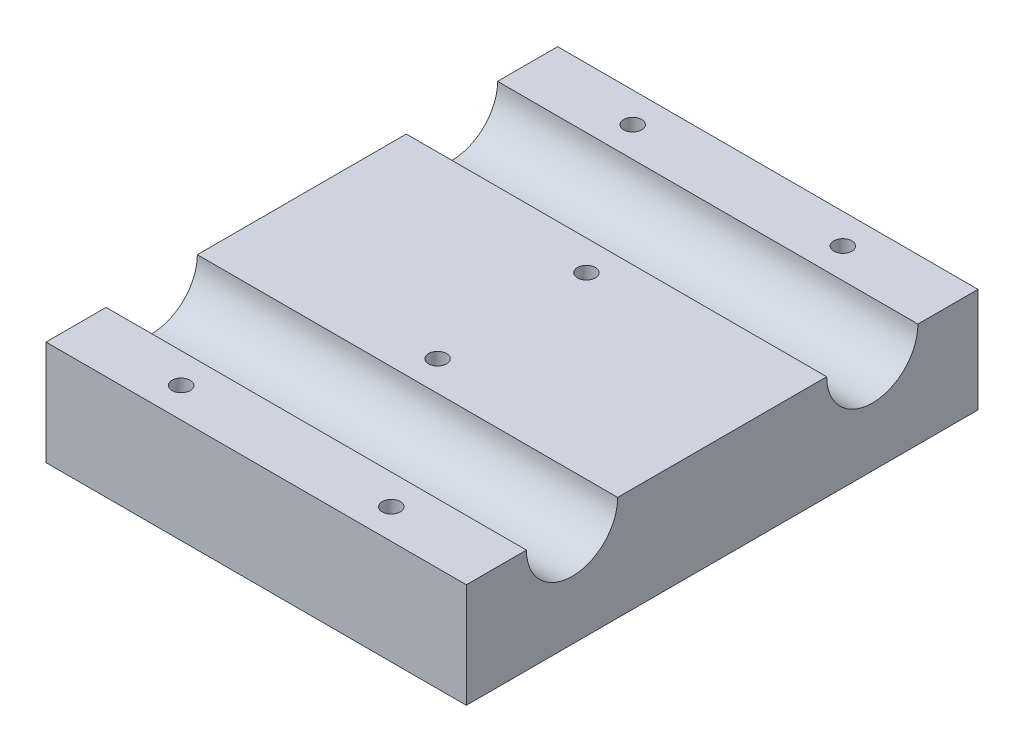
ISO-10303-21;
HEADER;
FILE_DESCRIPTION(('STEP AP214'),'2;1');
FILE_NAME('part.step','',(''),(''),'','','');
FILE_SCHEMA(('AUTOMOTIVE_DESIGN { 1 0 10303 214 1 1 1 1 }'));
ENDSEC;
DATA;
#1=APPLICATION_CONTEXT('core data for automotive mechanical design processes');
#2=APPLICATION_PROTOCOL_DEFINITION('international standard','automotive_design',2000,#1);
#3=PRODUCT_CONTEXT('',#1,'mechanical');
#4=PRODUCT('Part','Part','',(#3));
#5=PRODUCT_RELATED_PRODUCT_CATEGORY('part','',(#4));
#6=PRODUCT_DEFINITION_FORMATION('','',#4);
#7=PRODUCT_DEFINITION_CONTEXT('part definition',#1,'design');
#8=PRODUCT_DEFINITION('design','',#6,#7);
#9=PRODUCT_DEFINITION_SHAPE('','',#8);
#10=(LENGTH_UNIT() NAMED_UNIT(*) SI_UNIT(.MILLI.,.METRE.));
#11=(NAMED_UNIT(*) PLANE_ANGLE_UNIT() SI_UNIT($,.RADIAN.));
#12=(NAMED_UNIT(*) SI_UNIT($,.STERADIAN.) SOLID_ANGLE_UNIT());
#13=UNCERTAINTY_MEASURE_WITH_UNIT(LENGTH_MEASURE(1.E-05),#10,'distance_accuracy_value','');
#14=(GEOMETRIC_REPRESENTATION_CONTEXT(3) GLOBAL_UNCERTAINTY_ASSIGNED_CONTEXT((#13)) GLOBAL_UNIT_ASSIGNED_CONTEXT((#10,
#11,#12)) REPRESENTATION_CONTEXT('',''));
#15=CARTESIAN_POINT('',(0.,0.,0.));
#16=DIRECTION('',(0.,0.,1.));
#17=DIRECTION('',(1.,0.,0.));
#18=AXIS2_PLACEMENT_3D('',#15,#16,#17);
#19=CARTESIAN_POINT('',(70.,17.3906663866349,-67.6));
#20=DIRECTION('',(-1.,0.,0.));
#21=DIRECTION('',(0.,0.,1.));
#22=AXIS2_PLACEMENT_3D('',#19,#20,#21);
#23=CYLINDRICAL_SURFACE('',#22,7.6);
#24=CARTESIAN_POINT('',(0.,17.3906663866349,-67.6));
#25=DIRECTION('',(1.,0.,0.));
#26=DIRECTION('',(0.,0.,-1.));
#27=AXIS2_PLACEMENT_3D('',#24,#25,#26);
#28=CIRCLE('',#27,7.6);
#29=CARTESIAN_POINT('',(0.,17.3906663866349,-60.));
#30=VERTEX_POINT('',#29);
#31=CARTESIAN_POINT('',(0.,17.3906663866349,-75.2));
#32=VERTEX_POINT('',#31);
#33=EDGE_CURVE('E140',#30,#32,#28,.T.);
#34=ORIENTED_EDGE('',*,*,#33,.F.);
#35=DIRECTION('',(-1.,0.,0.));
#36=VECTOR('',#35,1.);
#37=CARTESIAN_POINT('',(70.,17.3906663866349,-60.));
#38=LINE('',#37,#36);
#39=CARTESIAN_POINT('',(70.,17.3906663866349,-60.));
#40=VERTEX_POINT('',#39);
#41=EDGE_CURVE('E11',#40,#30,#38,.T.);
#42=ORIENTED_EDGE('',*,*,#41,.F.);
#43=CARTESIAN_POINT('',(70.,17.3906663866349,-67.6));
#44=DIRECTION('',(1.,0.,0.));
#45=DIRECTION('',(0.,0.,-1.));
#46=AXIS2_PLACEMENT_3D('',#43,#44,#45);
#47=CIRCLE('',#46,7.6);
#48=CARTESIAN_POINT('',(70.,17.3906663866349,-75.2));
#49=VERTEX_POINT('',#48);
#50=EDGE_CURVE('E161',#40,#49,#47,.T.);
#51=ORIENTED_EDGE('',*,*,#50,.T.);
#52=DIRECTION('',(-1.,0.,0.));
#53=VECTOR('',#52,1.);
#54=CARTESIAN_POINT('',(70.,17.3906663866349,-75.2));
#55=LINE('',#54,#53);
#56=EDGE_CURVE('E63',#49,#32,#55,.T.);
#57=ORIENTED_EDGE('',*,*,#56,.T.);
#58=EDGE_LOOP('',(#34,#42,#51,#57));
#59=FACE_BOUND('',#58,.T.);
#60=ADVANCED_FACE('F47',(#59),#23,.F.);
#61=CARTESIAN_POINT('',(70.,17.3906663866349,0.));
#62=DIRECTION('',(0.,1.,0.));
#63=DIRECTION('',(0.,0.,1.));
#64=AXIS2_PLACEMENT_3D('',#61,#62,#63);
#65=PLANE('',#64);
#66=CARTESIAN_POINT('',(35.,17.3906663866349,-30.2));
#67=DIRECTION('',(0.,1.,0.));
#68=DIRECTION('',(0.,0.,1.));
#69=AXIS2_PLACEMENT_3D('',#66,#67,#68);
#70=CIRCLE('',#69,1.5);
#71=CARTESIAN_POINT('',(35.,17.3906663866349,-28.7));
#72=VERTEX_POINT('',#71);
#73=EDGE_CURVE('E267',#72,#72,#70,.T.);
#74=ORIENTED_EDGE('',*,*,#73,.F.);
#75=EDGE_LOOP('',(#74));
#76=FACE_BOUND('',#75,.T.);
#77=CARTESIAN_POINT('',(35.,17.3906663866349,-55.));
#78=DIRECTION('',(0.,1.,0.));
#79=DIRECTION('',(0.,0.,1.));
#80=AXIS2_PLACEMENT_3D('',#77,#78,#79);
#81=CIRCLE('',#80,1.5);
#82=CARTESIAN_POINT('',(35.,17.3906663866349,-53.5));
#83=VERTEX_POINT('',#82);
#84=EDGE_CURVE('E271',#83,#83,#81,.T.);
#85=ORIENTED_EDGE('',*,*,#84,.F.);
#86=EDGE_LOOP('',(#85));
#87=FACE_BOUND('',#86,.T.);
#88=DIRECTION('',(0.,0.,-1.));
#89=VECTOR('',#88,1.);
#90=CARTESIAN_POINT('',(0.,17.3906663866349,0.));
#91=LINE('',#90,#89);
#92=CARTESIAN_POINT('',(0.,17.3906663866349,-25.2));
#93=VERTEX_POINT('',#92);
#94=EDGE_CURVE('E142',#93,#30,#91,.T.);
#95=ORIENTED_EDGE('',*,*,#94,.F.);
#96=DIRECTION('',(-1.,0.,0.));
#97=VECTOR('',#96,1.);
#98=CARTESIAN_POINT('',(70.,17.3906663866349,-25.2));
#99=LINE('',#98,#97);
#100=CARTESIAN_POINT('',(70.,17.3906663866349,-25.2));
#101=VERTEX_POINT('',#100);
#102=EDGE_CURVE('E55',#101,#93,#99,.T.);
#103=ORIENTED_EDGE('',*,*,#102,.F.);
#104=DIRECTION('',(0.,0.,-1.));
#105=VECTOR('',#104,1.);
#106=CARTESIAN_POINT('',(70.,17.3906663866349,0.));
#107=LINE('',#106,#105);
#108=EDGE_CURVE('E187',#101,#40,#107,.T.);
#109=ORIENTED_EDGE('',*,*,#108,.T.);
#110=ORIENTED_EDGE('',*,*,#41,.T.);
#111=EDGE_LOOP('',(#95,#103,#109,#110));
#112=FACE_BOUND('',#111,.T.);
#113=ADVANCED_FACE('F178',(#76,#87,#112),#65,.T.);
#114=CARTESIAN_POINT('',(70.,17.3906663866349,-17.6));
#115=DIRECTION('',(-1.,0.,0.));
#116=DIRECTION('',(0.,0.,1.));
#117=AXIS2_PLACEMENT_3D('',#114,#115,#116);
#118=CYLINDRICAL_SURFACE('',#117,7.6);
#119=CARTESIAN_POINT('',(0.,17.3906663866349,-17.6));
#120=DIRECTION('',(1.,0.,0.));
#121=DIRECTION('',(0.,0.,-1.));
#122=AXIS2_PLACEMENT_3D('',#119,#120,#121);
#123=CIRCLE('',#122,7.6);
#124=CARTESIAN_POINT('',(0.,17.3906663866349,-10.));
#125=VERTEX_POINT('',#124);
#126=EDGE_CURVE('E146',#125,#93,#123,.T.);
#127=ORIENTED_EDGE('',*,*,#126,.F.);
#128=DIRECTION('',(-1.,0.,0.));
#129=VECTOR('',#128,1.);
#130=CARTESIAN_POINT('',(70.,17.3906663866349,-10.));
#131=LINE('',#130,#129);
#132=CARTESIAN_POINT('',(70.,17.3906663866349,-10.));
#133=VERTEX_POINT('',#132);
#134=EDGE_CURVE('E167',#133,#125,#131,.T.);
#135=ORIENTED_EDGE('',*,*,#134,.F.);
#136=CARTESIAN_POINT('',(70.,17.3906663866349,-17.6));
#137=DIRECTION('',(1.,0.,0.));
#138=DIRECTION('',(0.,0.,-1.));
#139=AXIS2_PLACEMENT_3D('',#136,#137,#138);
#140=CIRCLE('',#139,7.6);
#141=EDGE_CURVE('E174',#133,#101,#140,.T.);
#142=ORIENTED_EDGE('',*,*,#141,.T.);
#143=ORIENTED_EDGE('',*,*,#102,.T.);
#144=EDGE_LOOP('',(#127,#135,#142,#143));
#145=FACE_BOUND('',#144,.T.);
#146=ADVANCED_FACE('F172',(#145),#118,.F.);
#147=CARTESIAN_POINT('',(70.,17.3906663866349,0.));
#148=DIRECTION('',(0.,1.,0.));
#149=DIRECTION('',(0.,0.,1.));
#150=AXIS2_PLACEMENT_3D('',#147,#148,#149);
#151=PLANE('',#150);
#152=CARTESIAN_POINT('',(17.5,17.3906663866349,-5.));
#153=DIRECTION('',(0.,1.,0.));
#154=DIRECTION('',(0.,0.,1.));
#155=AXIS2_PLACEMENT_3D('',#152,#153,#154);
#156=CIRCLE('',#155,1.5);
#157=CARTESIAN_POINT('',(17.5,17.3906663866349,-3.5));
#158=VERTEX_POINT('',#157);
#159=EDGE_CURVE('E256',#158,#158,#156,.T.);
#160=ORIENTED_EDGE('',*,*,#159,.F.);
#161=EDGE_LOOP('',(#160));
#162=FACE_BOUND('',#161,.T.);
#163=CARTESIAN_POINT('',(52.5,17.3906663866349,-5.));
#164=DIRECTION('',(0.,1.,0.));
#165=DIRECTION('',(0.,0.,1.));
#166=AXIS2_PLACEMENT_3D('',#163,#164,#165);
#167=CIRCLE('',#166,1.5);
#168=CARTESIAN_POINT('',(52.5,17.3906663866349,-3.5));
#169=VERTEX_POINT('',#168);
#170=EDGE_CURVE('E253',#169,#169,#167,.T.);
#171=ORIENTED_EDGE('',*,*,#170,.F.);
#172=EDGE_LOOP('',(#171));
#173=FACE_BOUND('',#172,.T.);
#174=DIRECTION('',(0.,0.,-1.));
#175=VECTOR('',#174,1.);
#176=CARTESIAN_POINT('',(0.,17.3906663866349,0.));
#177=LINE('',#176,#175);
#178=CARTESIAN_POINT('',(0.,17.3906663866349,0.));
#179=VERTEX_POINT('',#178);
#180=EDGE_CURVE('E149',#179,#125,#177,.T.);
#181=ORIENTED_EDGE('',*,*,#180,.F.);
#182=DIRECTION('',(-1.,0.,0.));
#183=VECTOR('',#182,1.);
#184=CARTESIAN_POINT('',(70.,17.3906663866349,0.));
#185=LINE('',#184,#183);
#186=CARTESIAN_POINT('',(70.,17.3906663866349,0.));
#187=VERTEX_POINT('',#186);
#188=EDGE_CURVE('E165',#187,#179,#185,.T.);
#189=ORIENTED_EDGE('',*,*,#188,.F.);
#190=DIRECTION('',(0.,0.,-1.));
#191=VECTOR('',#190,1.);
#192=CARTESIAN_POINT('',(70.,17.3906663866349,0.));
#193=LINE('',#192,#191);
#194=EDGE_CURVE('E186',#187,#133,#193,.T.);
#195=ORIENTED_EDGE('',*,*,#194,.T.);
#196=ORIENTED_EDGE('',*,*,#134,.T.);
#197=EDGE_LOOP('',(#181,#189,#195,#196));
#198=FACE_BOUND('',#197,.T.);
#199=ADVANCED_FACE('F184',(#162,#173,#198),#151,.T.);
#200=CARTESIAN_POINT('',(70.,0.,0.));
#201=DIRECTION('',(0.,0.,1.));
#202=DIRECTION('',(1.,0.,0.));
#203=AXIS2_PLACEMENT_3D('',#200,#201,#202);
#204=PLANE('',#203);
#205=DIRECTION('',(0.,1.,0.));
#206=VECTOR('',#205,1.);
#207=CARTESIAN_POINT('',(0.,0.,0.));
#208=LINE('',#207,#206);
#209=CARTESIAN_POINT('',(0.,0.,0.));
#210=VERTEX_POINT('',#209);
#211=EDGE_CURVE('E152',#210,#179,#208,.T.);
#212=ORIENTED_EDGE('',*,*,#211,.F.);
#213=DIRECTION('',(-1.,0.,0.));
#214=VECTOR('',#213,1.);
#215=CARTESIAN_POINT('',(70.,0.,0.));
#216=LINE('',#215,#214);
#217=CARTESIAN_POINT('',(70.,0.,0.));
#218=VERTEX_POINT('',#217);
#219=EDGE_CURVE('E132',#218,#210,#216,.T.);
#220=ORIENTED_EDGE('',*,*,#219,.F.);
#221=DIRECTION('',(0.,1.,0.));
#222=VECTOR('',#221,1.);
#223=CARTESIAN_POINT('',(70.,0.,0.));
#224=LINE('',#223,#222);
#225=EDGE_CURVE('E122',#218,#187,#224,.T.);
#226=ORIENTED_EDGE('',*,*,#225,.T.);
#227=ORIENTED_EDGE('',*,*,#188,.T.);
#228=EDGE_LOOP('',(#212,#220,#226,#227));
#229=FACE_BOUND('',#228,.T.);
#230=ADVANCED_FACE('F193',(#229),#204,.T.);
#231=CARTESIAN_POINT('',(70.,0.,0.));
#232=DIRECTION('',(0.,1.,0.));
#233=DIRECTION('',(0.,0.,1.));
#234=AXIS2_PLACEMENT_3D('',#231,#232,#233);
#235=PLANE('',#234);
#236=CARTESIAN_POINT('',(35.,0.,-30.2));
#237=DIRECTION('',(0.,1.,0.));
#238=DIRECTION('',(0.,0.,1.));
#239=AXIS2_PLACEMENT_3D('',#236,#237,#238);
#240=CIRCLE('',#239,1.5);
#241=CARTESIAN_POINT('',(35.,0.,-28.7));
#242=VERTEX_POINT('',#241);
#243=EDGE_CURVE('E233',#242,#242,#240,.F.);
#244=ORIENTED_EDGE('',*,*,#243,.F.);
#245=EDGE_LOOP('',(#244));
#246=FACE_BOUND('',#245,.T.);
#247=CARTESIAN_POINT('',(17.5,0.,-80.2));
#248=DIRECTION('',(0.,1.,0.));
#249=DIRECTION('',(0.,0.,1.));
#250=AXIS2_PLACEMENT_3D('',#247,#248,#249);
#251=CIRCLE('',#250,1.5);
#252=CARTESIAN_POINT('',(17.5,0.,-78.7));
#253=VERTEX_POINT('',#252);
#254=EDGE_CURVE('E237',#253,#253,#251,.F.);
#255=ORIENTED_EDGE('',*,*,#254,.F.);
#256=EDGE_LOOP('',(#255));
#257=FACE_BOUND('',#256,.T.);
#258=CARTESIAN_POINT('',(52.5,0.,-80.2));
#259=DIRECTION('',(0.,1.,0.));
#260=DIRECTION('',(0.,0.,1.));
#261=AXIS2_PLACEMENT_3D('',#258,#259,#260);
#262=CIRCLE('',#261,1.5);
#263=CARTESIAN_POINT('',(52.5,0.,-78.7));
#264=VERTEX_POINT('',#263);
#265=EDGE_CURVE('E241',#264,#264,#262,.F.);
#266=ORIENTED_EDGE('',*,*,#265,.F.);
#267=EDGE_LOOP('',(#266));
#268=FACE_BOUND('',#267,.T.);
#269=CARTESIAN_POINT('',(17.5,0.,-5.));
#270=DIRECTION('',(0.,1.,0.));
#271=DIRECTION('',(0.,0.,1.));
#272=AXIS2_PLACEMENT_3D('',#269,#270,#271);
#273=CIRCLE('',#272,1.5);
#274=CARTESIAN_POINT('',(17.5,0.,-3.5));
#275=VERTEX_POINT('',#274);
#276=EDGE_CURVE('E245',#275,#275,#273,.F.);
#277=ORIENTED_EDGE('',*,*,#276,.F.);
#278=EDGE_LOOP('',(#277));
#279=FACE_BOUND('',#278,.T.);
#280=CARTESIAN_POINT('',(35.,0.,-55.));
#281=DIRECTION('',(0.,1.,0.));
#282=DIRECTION('',(0.,0.,1.));
#283=AXIS2_PLACEMENT_3D('',#280,#281,#282);
#284=CIRCLE('',#283,1.5);
#285=CARTESIAN_POINT('',(35.,0.,-53.5));
#286=VERTEX_POINT('',#285);
#287=EDGE_CURVE('E249',#286,#286,#284,.F.);
#288=ORIENTED_EDGE('',*,*,#287,.F.);
#289=EDGE_LOOP('',(#288));
#290=FACE_BOUND('',#289,.T.);
#291=CARTESIAN_POINT('',(52.5,0.,-5.));
#292=DIRECTION('',(0.,1.,0.));
#293=DIRECTION('',(0.,0.,1.));
#294=AXIS2_PLACEMENT_3D('',#291,#292,#293);
#295=CIRCLE('',#294,1.5);
#296=CARTESIAN_POINT('',(52.5,0.,-3.5));
#297=VERTEX_POINT('',#296);
#298=EDGE_CURVE('E143',#297,#297,#295,.F.);
#299=ORIENTED_EDGE('',*,*,#298,.F.);
#300=EDGE_LOOP('',(#299));
#301=FACE_BOUND('',#300,.T.);
#302=DIRECTION('',(0.,0.,-1.));
#303=VECTOR('',#302,1.);
#304=CARTESIAN_POINT('',(0.,0.,0.));
#305=LINE('',#304,#303);
#306=CARTESIAN_POINT('',(0.,0.,-85.2));
#307=VERTEX_POINT('',#306);
#308=EDGE_CURVE('E129',#210,#307,#305,.T.);
#309=ORIENTED_EDGE('',*,*,#308,.T.);
#310=DIRECTION('',(-1.,0.,0.));
#311=VECTOR('',#310,1.);
#312=CARTESIAN_POINT('',(70.,0.,-85.2));
#313=LINE('',#312,#311);
#314=CARTESIAN_POINT('',(70.,0.,-85.2));
#315=VERTEX_POINT('',#314);
#316=EDGE_CURVE('E126',#315,#307,#313,.T.);
#317=ORIENTED_EDGE('',*,*,#316,.F.);
#318=DIRECTION('',(0.,0.,-1.));
#319=VECTOR('',#318,1.);
#320=CARTESIAN_POINT('',(70.,0.,0.));
#321=LINE('',#320,#319);
#322=EDGE_CURVE('E114',#218,#315,#321,.T.);
#323=ORIENTED_EDGE('',*,*,#322,.F.);
#324=ORIENTED_EDGE('',*,*,#219,.T.);
#325=EDGE_LOOP('',(#309,#317,#323,#324));
#326=FACE_BOUND('',#325,.T.);
#327=ADVANCED_FACE('F127',(#246,#257,#268,#279,#290,#301,#326),#235,.F.);
#328=CARTESIAN_POINT('',(70.,0.,-85.2));
#329=DIRECTION('',(0.,0.,1.));
#330=DIRECTION('',(1.,0.,0.));
#331=AXIS2_PLACEMENT_3D('',#328,#329,#330);
#332=PLANE('',#331);
#333=DIRECTION('',(0.,1.,0.));
#334=VECTOR('',#333,1.);
#335=CARTESIAN_POINT('',(0.,0.,-85.2));
#336=LINE('',#335,#334);
#337=CARTESIAN_POINT('',(0.,17.3906663866349,-85.2));
#338=VERTEX_POINT('',#337);
#339=EDGE_CURVE('E156',#307,#338,#336,.T.);
#340=ORIENTED_EDGE('',*,*,#339,.T.);
#341=DIRECTION('',(-1.,0.,0.));
#342=VECTOR('',#341,1.);
#343=CARTESIAN_POINT('',(70.,17.3906663866349,-85.2));
#344=LINE('',#343,#342);
#345=CARTESIAN_POINT('',(70.,17.3906663866349,-85.2));
#346=VERTEX_POINT('',#345);
#347=EDGE_CURVE('E89',#346,#338,#344,.T.);
#348=ORIENTED_EDGE('',*,*,#347,.F.);
#349=DIRECTION('',(0.,1.,0.));
#350=VECTOR('',#349,1.);
#351=CARTESIAN_POINT('',(70.,0.,-85.2));
#352=LINE('',#351,#350);
#353=EDGE_CURVE('E119',#315,#346,#352,.T.);
#354=ORIENTED_EDGE('',*,*,#353,.F.);
#355=ORIENTED_EDGE('',*,*,#316,.T.);
#356=EDGE_LOOP('',(#340,#348,#354,#355));
#357=FACE_BOUND('',#356,.T.);
#358=ADVANCED_FACE('F134',(#357),#332,.F.);
#359=CARTESIAN_POINT('',(70.,17.3906663866349,0.));
#360=DIRECTION('',(0.,1.,0.));
#361=DIRECTION('',(0.,0.,1.));
#362=AXIS2_PLACEMENT_3D('',#359,#360,#361);
#363=PLANE('',#362);
#364=CARTESIAN_POINT('',(17.5,17.3906663866349,-80.2));
#365=DIRECTION('',(0.,1.,0.));
#366=DIRECTION('',(0.,0.,1.));
#367=AXIS2_PLACEMENT_3D('',#364,#365,#366);
#368=CIRCLE('',#367,1.5);
#369=CARTESIAN_POINT('',(17.5,17.3906663866349,-78.7));
#370=VERTEX_POINT('',#369);
#371=EDGE_CURVE('E263',#370,#370,#368,.T.);
#372=ORIENTED_EDGE('',*,*,#371,.F.);
#373=EDGE_LOOP('',(#372));
#374=FACE_BOUND('',#373,.T.);
#375=CARTESIAN_POINT('',(52.5,17.3906663866349,-80.2));
#376=DIRECTION('',(0.,1.,0.));
#377=DIRECTION('',(0.,0.,1.));
#378=AXIS2_PLACEMENT_3D('',#375,#376,#377);
#379=CIRCLE('',#378,1.5);
#380=CARTESIAN_POINT('',(52.5,17.3906663866349,-78.7));
#381=VERTEX_POINT('',#380);
#382=EDGE_CURVE('E259',#381,#381,#379,.T.);
#383=ORIENTED_EDGE('',*,*,#382,.F.);
#384=EDGE_LOOP('',(#383));
#385=FACE_BOUND('',#384,.T.);
#386=DIRECTION('',(0.,0.,-1.));
#387=VECTOR('',#386,1.);
#388=CARTESIAN_POINT('',(0.,17.3906663866349,0.));
#389=LINE('',#388,#387);
#390=EDGE_CURVE('E158',#32,#338,#389,.T.);
#391=ORIENTED_EDGE('',*,*,#390,.F.);
#392=ORIENTED_EDGE('',*,*,#56,.F.);
#393=DIRECTION('',(0.,0.,-1.));
#394=VECTOR('',#393,1.);
#395=CARTESIAN_POINT('',(70.,17.3906663866349,0.));
#396=LINE('',#395,#394);
#397=EDGE_CURVE('E135',#49,#346,#396,.T.);
#398=ORIENTED_EDGE('',*,*,#397,.T.);
#399=ORIENTED_EDGE('',*,*,#347,.T.);
#400=EDGE_LOOP('',(#391,#392,#398,#399));
#401=FACE_BOUND('',#400,.T.);
#402=ADVANCED_FACE('F194',(#374,#385,#401),#363,.T.);
#403=CARTESIAN_POINT('',(70.,0.,0.));
#404=DIRECTION('',(1.,0.,0.));
#405=DIRECTION('',(0.,0.,-1.));
#406=AXIS2_PLACEMENT_3D('',#403,#404,#405);
#407=PLANE('',#406);
#408=ORIENTED_EDGE('',*,*,#50,.F.);
#409=ORIENTED_EDGE('',*,*,#108,.F.);
#410=ORIENTED_EDGE('',*,*,#141,.F.);
#411=ORIENTED_EDGE('',*,*,#194,.F.);
#412=ORIENTED_EDGE('',*,*,#225,.F.);
#413=ORIENTED_EDGE('',*,*,#322,.T.);
#414=ORIENTED_EDGE('',*,*,#353,.T.);
#415=ORIENTED_EDGE('',*,*,#397,.F.);
#416=EDGE_LOOP('',(#408,#409,#410,#411,#412,#413,#414,#415));
#417=FACE_BOUND('',#416,.T.);
#418=ADVANCED_FACE('F116',(#417),#407,.T.);
#419=CARTESIAN_POINT('',(0.,0.,0.));
#420=DIRECTION('',(1.,0.,0.));
#421=DIRECTION('',(0.,0.,-1.));
#422=AXIS2_PLACEMENT_3D('',#419,#420,#421);
#423=PLANE('',#422);
#424=ORIENTED_EDGE('',*,*,#33,.T.);
#425=ORIENTED_EDGE('',*,*,#390,.T.);
#426=ORIENTED_EDGE('',*,*,#339,.F.);
#427=ORIENTED_EDGE('',*,*,#308,.F.);
#428=ORIENTED_EDGE('',*,*,#211,.T.);
#429=ORIENTED_EDGE('',*,*,#180,.T.);
#430=ORIENTED_EDGE('',*,*,#126,.T.);
#431=ORIENTED_EDGE('',*,*,#94,.T.);
#432=EDGE_LOOP('',(#424,#425,#426,#427,#428,#429,#430,#431));
#433=FACE_BOUND('',#432,.T.);
#434=ADVANCED_FACE('F180',(#433),#423,.F.);
#435=CARTESIAN_POINT('',(52.5,-4.24264068711929,-80.2));
#436=DIRECTION('',(0.,1.,0.));
#437=DIRECTION('',(0.,0.,1.));
#438=AXIS2_PLACEMENT_3D('',#435,#436,#437);
#439=CYLINDRICAL_SURFACE('',#438,1.5);
#440=ORIENTED_EDGE('',*,*,#265,.T.);
#441=EDGE_LOOP('',(#440));
#442=FACE_BOUND('',#441,.T.);
#443=ORIENTED_EDGE('',*,*,#382,.T.);
#444=EDGE_LOOP('',(#443));
#445=FACE_BOUND('',#444,.T.);
#446=ADVANCED_FACE('F297',(#442,#445),#439,.F.);
#447=CARTESIAN_POINT('',(17.5,-4.24264068711929,-80.2));
#448=DIRECTION('',(0.,1.,0.));
#449=DIRECTION('',(0.,0.,1.));
#450=AXIS2_PLACEMENT_3D('',#447,#448,#449);
#451=CYLINDRICAL_SURFACE('',#450,1.5);
#452=ORIENTED_EDGE('',*,*,#254,.T.);
#453=EDGE_LOOP('',(#452));
#454=FACE_BOUND('',#453,.T.);
#455=ORIENTED_EDGE('',*,*,#371,.T.);
#456=EDGE_LOOP('',(#455));
#457=FACE_BOUND('',#456,.T.);
#458=ADVANCED_FACE('F292',(#454,#457),#451,.F.);
#459=CARTESIAN_POINT('',(52.5,-4.24264068711929,-5.));
#460=DIRECTION('',(0.,1.,0.));
#461=DIRECTION('',(0.,0.,1.));
#462=AXIS2_PLACEMENT_3D('',#459,#460,#461);
#463=CYLINDRICAL_SURFACE('',#462,1.5);
#464=ORIENTED_EDGE('',*,*,#298,.T.);
#465=EDGE_LOOP('',(#464));
#466=FACE_BOUND('',#465,.T.);
#467=ORIENTED_EDGE('',*,*,#170,.T.);
#468=EDGE_LOOP('',(#467));
#469=FACE_BOUND('',#468,.T.);
#470=ADVANCED_FACE('F282',(#466,#469),#463,.F.);
#471=CARTESIAN_POINT('',(35.,-4.24264068711929,-55.));
#472=DIRECTION('',(0.,1.,0.));
#473=DIRECTION('',(0.,0.,1.));
#474=AXIS2_PLACEMENT_3D('',#471,#472,#473);
#475=CYLINDRICAL_SURFACE('',#474,1.5);
#476=ORIENTED_EDGE('',*,*,#287,.T.);
#477=EDGE_LOOP('',(#476));
#478=FACE_BOUND('',#477,.T.);
#479=ORIENTED_EDGE('',*,*,#84,.T.);
#480=EDGE_LOOP('',(#479));
#481=FACE_BOUND('',#480,.T.);
#482=ADVANCED_FACE('F278',(#478,#481),#475,.F.);
#483=CARTESIAN_POINT('',(17.5,-4.24264068711929,-5.));
#484=DIRECTION('',(0.,1.,0.));
#485=DIRECTION('',(0.,0.,1.));
#486=AXIS2_PLACEMENT_3D('',#483,#484,#485);
#487=CYLINDRICAL_SURFACE('',#486,1.5);
#488=ORIENTED_EDGE('',*,*,#276,.T.);
#489=EDGE_LOOP('',(#488));
#490=FACE_BOUND('',#489,.T.);
#491=ORIENTED_EDGE('',*,*,#159,.T.);
#492=EDGE_LOOP('',(#491));
#493=FACE_BOUND('',#492,.T.);
#494=ADVANCED_FACE('F281',(#490,#493),#487,.F.);
#495=CARTESIAN_POINT('',(35.,-4.24264068711929,-30.2));
#496=DIRECTION('',(0.,1.,0.));
#497=DIRECTION('',(0.,0.,1.));
#498=AXIS2_PLACEMENT_3D('',#495,#496,#497);
#499=CYLINDRICAL_SURFACE('',#498,1.5);
#500=ORIENTED_EDGE('',*,*,#243,.T.);
#501=EDGE_LOOP('',(#500));
#502=FACE_BOUND('',#501,.T.);
#503=ORIENTED_EDGE('',*,*,#73,.T.);
#504=EDGE_LOOP('',(#503));
#505=FACE_BOUND('',#504,.T.);
#506=ADVANCED_FACE('F289',(#502,#505),#499,.F.);
#507=CLOSED_SHELL('',(#60,#113,#146,#199,#230,#327,#358,#402,#418,#434,#446,#458,#470,#482,#494,#506));
#508=MANIFOLD_SOLID_BREP('B2',#507);
#509=ADVANCED_BREP_SHAPE_REPRESENTATION('',(#18,#508),#14);
#510=SHAPE_DEFINITION_REPRESENTATION(#9,#509);
ENDSEC;
END-ISO-10303-21;
